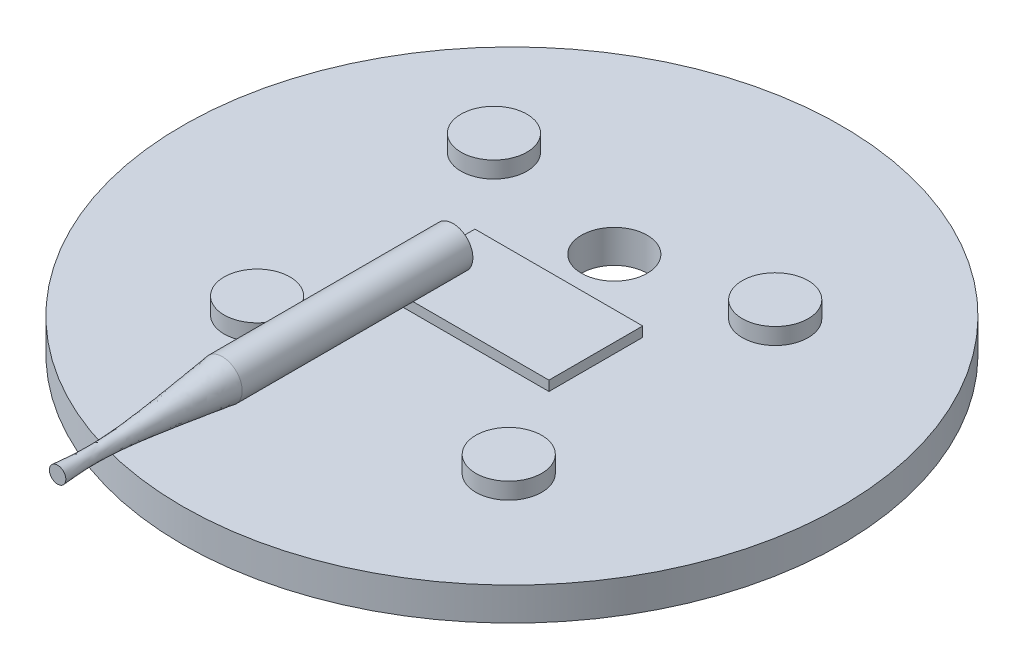
ISO-10303-21;
HEADER;
FILE_DESCRIPTION(('STEP AP214'),'2;1');
FILE_NAME('part.step','',(''),(''),'','','');
FILE_SCHEMA(('AUTOMOTIVE_DESIGN { 1 0 10303 214 1 1 1 1 }'));
ENDSEC;
DATA;
#1=APPLICATION_CONTEXT('core data for automotive mechanical design processes');
#2=APPLICATION_PROTOCOL_DEFINITION('international standard','automotive_design',2000,#1);
#3=PRODUCT_CONTEXT('',#1,'mechanical');
#4=PRODUCT('Part','Part','',(#3));
#5=PRODUCT_RELATED_PRODUCT_CATEGORY('part','',(#4));
#6=PRODUCT_DEFINITION_FORMATION('','',#4);
#7=PRODUCT_DEFINITION_CONTEXT('part definition',#1,'design');
#8=PRODUCT_DEFINITION('design','',#6,#7);
#9=PRODUCT_DEFINITION_SHAPE('','',#8);
#10=(LENGTH_UNIT() NAMED_UNIT(*) SI_UNIT(.MILLI.,.METRE.));
#11=(NAMED_UNIT(*) PLANE_ANGLE_UNIT() SI_UNIT($,.RADIAN.));
#12=(NAMED_UNIT(*) SI_UNIT($,.STERADIAN.) SOLID_ANGLE_UNIT());
#13=UNCERTAINTY_MEASURE_WITH_UNIT(LENGTH_MEASURE(1.E-05),#10,'distance_accuracy_value','');
#14=(GEOMETRIC_REPRESENTATION_CONTEXT(3) GLOBAL_UNCERTAINTY_ASSIGNED_CONTEXT((#13)) GLOBAL_UNIT_ASSIGNED_CONTEXT((#10,
#11,#12)) REPRESENTATION_CONTEXT('',''));
#15=CARTESIAN_POINT('',(0.,0.,0.));
#16=DIRECTION('',(0.,0.,1.));
#17=DIRECTION('',(1.,0.,0.));
#18=AXIS2_PLACEMENT_3D('',#15,#16,#17);
#19=CARTESIAN_POINT('',(-17.8510947741717,9.38178560839525,70.));
#20=DIRECTION('',(0.,0.,-1.));
#21=DIRECTION('',(-1.,0.,0.));
#22=AXIS2_PLACEMENT_3D('',#19,#20,#21);
#23=CYLINDRICAL_SURFACE('',#22,6.);
#24=CARTESIAN_POINT('',(-17.8510947741717,9.38178560839525,70.));
#25=DIRECTION('',(0.,0.,-1.));
#26=DIRECTION('',(-1.,0.,0.));
#27=AXIS2_PLACEMENT_3D('',#24,#25,#26);
#28=CIRCLE('',#27,6.);
#29=CARTESIAN_POINT('',(-11.9734748792229,8.17613874031923,70.));
#30=VERTEX_POINT('',#29);
#31=EDGE_CURVE('E12',#30,#30,#28,.F.);
#32=ORIENTED_EDGE('',*,*,#31,.F.);
#33=EDGE_LOOP('',(#32));
#34=FACE_BOUND('',#33,.T.);
#35=CARTESIAN_POINT('',(-17.8510947741717,9.38178560839525,0.));
#36=DIRECTION('',(0.,0.,1.));
#37=DIRECTION('',(1.,0.,0.));
#38=AXIS2_PLACEMENT_3D('',#35,#36,#37);
#39=CIRCLE('',#38,6.);
#40=CARTESIAN_POINT('',(-11.8510947741717,9.38178560839525,0.));
#41=VERTEX_POINT('',#40);
#42=EDGE_CURVE('E52',#41,#41,#39,.T.);
#43=ORIENTED_EDGE('',*,*,#42,.T.);
#44=EDGE_LOOP('',(#43));
#45=FACE_BOUND('',#44,.T.);
#46=ADVANCED_FACE('F45',(#34,#45),#23,.T.);
#47=CARTESIAN_POINT('',(-17.8510947741717,9.38178560839525,0.));
#48=DIRECTION('',(0.,0.,1.));
#49=DIRECTION('',(1.,0.,0.));
#50=AXIS2_PLACEMENT_3D('',#47,#48,#49);
#51=PLANE('',#50);
#52=ORIENTED_EDGE('',*,*,#42,.F.);
#53=EDGE_LOOP('',(#52));
#54=FACE_BOUND('',#53,.T.);
#55=ADVANCED_FACE('F78',(#54),#51,.F.);
#56=CARTESIAN_POINT('',(-17.8510947741717,9.38178560839525,120.));
#57=DIRECTION('',(0.,0.,1.));
#58=DIRECTION('',(1.,0.,0.));
#59=AXIS2_PLACEMENT_3D('',#56,#57,#58);
#60=PLANE('',#59);
#61=CARTESIAN_POINT('',(-17.8510947741717,9.38178560839525,120.));
#62=DIRECTION('',(0.,0.,1.));
#63=DIRECTION('',(1.,0.,0.));
#64=AXIS2_PLACEMENT_3D('',#61,#62,#63);
#65=CIRCLE('',#64,2.5);
#66=CARTESIAN_POINT('',(-19.0361616216132,7.18050948598466,120.));
#67=VERTEX_POINT('',#66);
#68=EDGE_CURVE('E56',#67,#67,#65,.T.);
#69=ORIENTED_EDGE('',*,*,#68,.T.);
#70=EDGE_LOOP('',(#69));
#71=FACE_BOUND('',#70,.T.);
#72=ADVANCED_FACE('F68',(#71),#60,.T.);
#73=CARTESIAN_POINT('',(-11.9734748792229,8.17613874031923,70.));
#74=CARTESIAN_POINT('',(-19.0361616216132,7.18050948598466,120.));
#75=CARTESIAN_POINT('',(-9.56218114307081,19.9313785302169,70.));
#76=CARTESIAN_POINT('',(-14.6336093767921,4.81037579110161,120.));
#77=CARTESIAN_POINT('',(-21.3174209329685,22.342672266369,70.));
#78=CARTESIAN_POINT('',(-12.263475681909,9.21292803592279,120.));
#79=CARTESIAN_POINT('',(-23.7287146691206,10.5874324764713,70.));
#80=CARTESIAN_POINT('',(-16.6660279267302,11.5830617308058,120.));
#81=CARTESIAN_POINT('',(-26.1400084052726,-1.1678073134264,70.));
#82=CARTESIAN_POINT('',(-21.0685801715514,13.9531954256889,120.));
#83=CARTESIAN_POINT('',(-14.3847686153749,-3.57910104957846,70.));
#84=CARTESIAN_POINT('',(-23.4387138664344,9.55064318086772,120.));
#85=CARTESIAN_POINT('',(-11.9734748792229,8.17613874031923,70.));
#86=CARTESIAN_POINT('',(-19.0361616216132,7.18050948598466,120.));
#87=(BOUNDED_SURFACE() B_SPLINE_SURFACE(3,1,((#73,#74),(#75,#76),(#77,#78),(#79,#80),(#81,#82),
(#83,#84),(#85,#86)),.UNSPECIFIED.,.T.,.F.,.F.) B_SPLINE_SURFACE_WITH_KNOTS((4,3,4),(2,2),(0.,
0.5,1.),(0.,1.),.UNSPECIFIED.) GEOMETRIC_REPRESENTATION_ITEM() RATIONAL_B_SPLINE_SURFACE(((1.,
1.),(0.333333333333333,0.333333333333333),(0.333333333333333,0.333333333333333),(1.,1.),
(0.333333333333333,0.333333333333333),(0.333333333333333,0.333333333333333),(1.,1.))) REPRESENTATION_ITEM('') SURFACE());
#88=CARTESIAN_POINT('',(-11.9734748792229,8.17613874031923,70.));
#89=CARTESIAN_POINT('',(-12.0470445327894,8.16576760225324,70.5208333333333));
#90=CARTESIAN_POINT('',(-12.120614186356,8.15539646418725,71.0416666666667));
#91=CARTESIAN_POINT('',(-12.2677534934891,8.13465418805528,72.0833333333333));
#92=CARTESIAN_POINT('',(-12.3413231470557,8.1242830499893,72.6041666666667));
#93=CARTESIAN_POINT('',(-12.4884624541888,8.10354077385733,73.6458333333333));
#94=CARTESIAN_POINT('',(-12.5620321077554,8.09316963579135,74.1666666666667));
#95=CARTESIAN_POINT('',(-12.7091714148885,8.07242735965938,75.2083333333333));
#96=CARTESIAN_POINT('',(-12.7827410684551,8.06205622159339,75.7291666666667));
#97=CARTESIAN_POINT('',(-12.9298803755882,8.04131394546142,76.7708333333333));
#98=CARTESIAN_POINT('',(-13.0034500291548,8.03094280739544,77.2916666666667));
#99=CARTESIAN_POINT('',(-13.1505893362879,8.01020053126346,78.3333333333333));
#100=CARTESIAN_POINT('',(-13.2241589898545,7.99982939319748,78.8541666666667));
#101=CARTESIAN_POINT('',(-13.3712982969876,7.97908711706551,79.8958333333333));
#102=CARTESIAN_POINT('',(-13.4448679505542,7.96871597899953,80.4166666666667));
#103=CARTESIAN_POINT('',(-13.5920072576873,7.94797370286756,81.4583333333333));
#104=CARTESIAN_POINT('',(-13.6655769112539,7.93760256480157,81.9791666666667));
#105=CARTESIAN_POINT('',(-13.812716218387,7.9168602886696,83.0208333333333));
#106=CARTESIAN_POINT('',(-13.8862858719536,7.90648915060362,83.5416666666667));
#107=CARTESIAN_POINT('',(-14.0334251790867,7.88574687447165,84.5833333333333));
#108=CARTESIAN_POINT('',(-14.1069948326533,7.87537573640566,85.1041666666667));
#109=CARTESIAN_POINT('',(-14.2541341397864,7.85463346027369,86.1458333333333));
#110=CARTESIAN_POINT('',(-14.327703793353,7.8442623222077,86.6666666666667));
#111=CARTESIAN_POINT('',(-14.4748431004861,7.82352004607574,87.7083333333333));
#112=CARTESIAN_POINT('',(-14.5484127540527,7.81314890800975,88.2291666666667));
#113=CARTESIAN_POINT('',(-14.6955520611858,7.79240663187778,89.2708333333333));
#114=CARTESIAN_POINT('',(-14.7691217147524,7.78203549381179,89.7916666666667));
#115=CARTESIAN_POINT('',(-14.9162610218855,7.76129321767982,90.8333333333333));
#116=CARTESIAN_POINT('',(-14.9898306754521,7.75092207961384,91.3541666666667));
#117=CARTESIAN_POINT('',(-15.1369699825852,7.73017980348187,92.3958333333333));
#118=CARTESIAN_POINT('',(-15.2105396361518,7.71980866541588,92.9166666666667));
#119=CARTESIAN_POINT('',(-15.3576789432849,7.69906638928391,93.9583333333333));
#120=CARTESIAN_POINT('',(-15.4312485968515,7.68869525121793,94.4791666666667));
#121=CARTESIAN_POINT('',(-15.5783879039846,7.66795297508596,95.5208333333333));
#122=CARTESIAN_POINT('',(-15.6519575575512,7.65758183701998,96.0416666666667));
#123=CARTESIAN_POINT('',(-15.7990968646843,7.636839560888,97.0833333333333));
#124=CARTESIAN_POINT('',(-15.8726665182509,7.62646842282202,97.6041666666667));
#125=CARTESIAN_POINT('',(-16.019805825384,7.60572614669005,98.6458333333333));
#126=CARTESIAN_POINT('',(-16.0933754789506,7.59535500862407,99.1666666666667));
#127=CARTESIAN_POINT('',(-16.2405147860837,7.5746127324921,100.208333333333));
#128=CARTESIAN_POINT('',(-16.3140844396503,7.56424159442611,100.729166666667));
#129=CARTESIAN_POINT('',(-16.4612237467834,7.54349931829414,101.770833333333));
#130=CARTESIAN_POINT('',(-16.53479340035,7.53312818022815,102.291666666667));
#131=CARTESIAN_POINT('',(-16.6819327074831,7.51238590409618,103.333333333333));
#132=CARTESIAN_POINT('',(-16.7555023610497,7.5020147660302,103.854166666667));
#133=CARTESIAN_POINT('',(-16.9026416681828,7.48127248989823,104.895833333333));
#134=CARTESIAN_POINT('',(-16.9762113217494,7.47090135183224,105.416666666667));
#135=CARTESIAN_POINT('',(-17.1233506288825,7.45015907570027,106.458333333333));
#136=CARTESIAN_POINT('',(-17.1969202824491,7.43978793763429,106.979166666667));
#137=CARTESIAN_POINT('',(-17.3440595895822,7.41904566150232,108.020833333333));
#138=CARTESIAN_POINT('',(-17.4176292431488,7.40867452343634,108.541666666667));
#139=CARTESIAN_POINT('',(-17.5647685502819,7.38793224730437,109.583333333333));
#140=CARTESIAN_POINT('',(-17.6383382038485,7.37756110923838,110.104166666667));
#141=CARTESIAN_POINT('',(-17.7854775109816,7.35681883310641,111.145833333333));
#142=CARTESIAN_POINT('',(-17.8590471645482,7.34644769504042,111.666666666667));
#143=CARTESIAN_POINT('',(-18.0061864716813,7.32570541890845,112.708333333333));
#144=CARTESIAN_POINT('',(-18.0797561252479,7.31533428084247,113.229166666667));
#145=CARTESIAN_POINT('',(-18.226895432381,7.2945920047105,114.270833333333));
#146=CARTESIAN_POINT('',(-18.3004650859476,7.28422086664451,114.791666666667));
#147=CARTESIAN_POINT('',(-18.4476043930807,7.26347859051254,115.833333333333));
#148=CARTESIAN_POINT('',(-18.5211740466473,7.25310745244656,116.354166666667));
#149=CARTESIAN_POINT('',(-18.6683133537804,7.23236517631459,117.395833333333));
#150=CARTESIAN_POINT('',(-18.741883007347,7.2219940382486,117.916666666667));
#151=CARTESIAN_POINT('',(-18.8890223144801,7.20125176211663,118.958333333333));
#152=CARTESIAN_POINT('',(-18.9625919680467,7.19088062405065,119.479166666667));
#153=CARTESIAN_POINT('',(-19.0361616216132,7.18050948598466,120.));
#154=B_SPLINE_CURVE_WITH_KNOTS('',3,(#88,#89,#90,#91,#92,#93,#94,#95,#96,#97,#98,#99,#100,#101,
#102,#103,#104,#105,#106,#107,#108,#109,#110,#111,#112,#113,#114,#115,#116,#117,#118,#119,#120,
#121,#122,#123,#124,#125,#126,#127,#128,#129,#130,#131,#132,#133,#134,#135,#136,#137,#138,#139,
#140,#141,#142,#143,#144,#145,#146,#147,#148,#149,#150,#151,#152,#153),.UNSPECIFIED.,.F.,.F.,(4,
2,2,2,2,2,2,2,2,2,2,2,2,2,2,2,2,2,2,2,2,2,2,2,2,2,2,2,2,2,2,2,4),(0.,1.57831769294912,
3.15663538589821,4.73495307884732,6.31327077179644,7.89158846474554,9.46990615769464,
11.0482238506438,12.6265415435929,14.204859236542,15.7831769294911,17.3614946224402,
18.9398123153893,20.5181300083384,22.0964477012875,23.6747653942366,25.2530830871857,
26.8314007801348,28.4097184730839,29.9880361660331,31.5663538589822,33.1446715519313,
34.7229892448804,36.3013069378295,37.8796246307786,39.4579423237277,41.0362600166768,
42.6145777096259,44.192895402575,45.7712130955241,47.3495307884732,48.9278484814224,
50.5061661743715),.UNSPECIFIED.);
#155=EDGE_CURVE('BSEAM77',#30,#67,#154,.T.);
#156=ORIENTED_EDGE('',*,*,#31,.T.);
#157=ORIENTED_EDGE('',*,*,#68,.F.);
#158=ORIENTED_EDGE('',*,*,#155,.T.);
#159=ORIENTED_EDGE('',*,*,#155,.F.);
#160=EDGE_LOOP('',(#156,#158,#157,#159));
#161=FACE_BOUND('',#160,.T.);
#162=ADVANCED_FACE('F77',(#161),#87,.T.);
#163=CLOSED_SHELL('',(#46,#55,#72,#162));
#164=MANIFOLD_SOLID_BREP('B2',#163);
#165=CARTESIAN_POINT('',(0.,-10.,0.));
#166=DIRECTION('',(0.,1.,0.));
#167=DIRECTION('',(0.,0.,1.));
#168=AXIS2_PLACEMENT_3D('',#165,#166,#167);
#169=CYLINDRICAL_SURFACE('',#168,100.);
#170=CARTESIAN_POINT('',(0.,-10.,0.));
#171=DIRECTION('',(0.,1.,0.));
#172=DIRECTION('',(0.,0.,1.));
#173=AXIS2_PLACEMENT_3D('',#170,#171,#172);
#174=CIRCLE('',#173,100.);
#175=CARTESIAN_POINT('',(0.,-10.,100.));
#176=VERTEX_POINT('',#175);
#177=EDGE_CURVE('E43',#176,#176,#174,.T.);
#178=ORIENTED_EDGE('',*,*,#177,.T.);
#179=EDGE_LOOP('',(#178));
#180=FACE_BOUND('',#179,.T.);
#181=CARTESIAN_POINT('',(0.,0.,0.));
#182=DIRECTION('',(0.,1.,0.));
#183=DIRECTION('',(0.,0.,1.));
#184=AXIS2_PLACEMENT_3D('',#181,#182,#183);
#185=CIRCLE('',#184,100.);
#186=CARTESIAN_POINT('',(0.,0.,100.));
#187=VERTEX_POINT('',#186);
#188=EDGE_CURVE('E135',#187,#187,#185,.T.);
#189=ORIENTED_EDGE('',*,*,#188,.F.);
#190=EDGE_LOOP('',(#189));
#191=FACE_BOUND('',#190,.T.);
#192=ADVANCED_FACE('F132',(#180,#191),#169,.T.);
#193=CARTESIAN_POINT('',(0.,-10.,0.));
#194=DIRECTION('',(0.,1.,0.));
#195=DIRECTION('',(0.,0.,1.));
#196=AXIS2_PLACEMENT_3D('',#193,#194,#195);
#197=PLANE('',#196);
#198=CARTESIAN_POINT('',(-0.694974250567611,-10.,-31.7644480540408));
#199=DIRECTION('',(0.,1.,0.));
#200=DIRECTION('',(0.,0.,1.));
#201=AXIS2_PLACEMENT_3D('',#198,#199,#200);
#202=CIRCLE('',#201,10.);
#203=CARTESIAN_POINT('',(-0.694974250567611,-10.,-21.7644480540408));
#204=VERTEX_POINT('',#203);
#205=EDGE_CURVE('E207',#204,#204,#202,.T.);
#206=ORIENTED_EDGE('',*,*,#205,.T.);
#207=EDGE_LOOP('',(#206));
#208=FACE_BOUND('',#207,.T.);
#209=ORIENTED_EDGE('',*,*,#177,.F.);
#210=EDGE_LOOP('',(#209));
#211=FACE_BOUND('',#210,.T.);
#212=ADVANCED_FACE('F252',(#208,#211),#197,.F.);
#213=CARTESIAN_POINT('',(0.,0.,0.));
#214=DIRECTION('',(0.,1.,0.));
#215=DIRECTION('',(0.,0.,1.));
#216=AXIS2_PLACEMENT_3D('',#213,#214,#215);
#217=PLANE('',#216);
#218=CARTESIAN_POINT('',(40.6413813486044,0.,-39.251018302468));
#219=DIRECTION('',(0.,1.,0.));
#220=DIRECTION('',(0.,0.,1.));
#221=AXIS2_PLACEMENT_3D('',#218,#219,#220);
#222=CIRCLE('',#221,10.);
#223=CARTESIAN_POINT('',(40.6413813486044,0.,-29.2510183024679));
#224=VERTEX_POINT('',#223);
#225=EDGE_CURVE('E234',#224,#224,#222,.T.);
#226=ORIENTED_EDGE('',*,*,#225,.F.);
#227=EDGE_LOOP('',(#226));
#228=FACE_BOUND('',#227,.T.);
#229=CARTESIAN_POINT('',(-45.7750295189545,0.,-40.3205283379575));
#230=DIRECTION('',(0.,1.,0.));
#231=DIRECTION('',(0.,0.,1.));
#232=AXIS2_PLACEMENT_3D('',#229,#230,#231);
#233=CIRCLE('',#232,10.);
#234=CARTESIAN_POINT('',(-45.7750295189545,0.,-30.3205283379575));
#235=VERTEX_POINT('',#234);
#236=EDGE_CURVE('E228',#235,#235,#233,.T.);
#237=ORIENTED_EDGE('',*,*,#236,.F.);
#238=EDGE_LOOP('',(#237));
#239=FACE_BOUND('',#238,.T.);
#240=CARTESIAN_POINT('',(-38.9301652918211,0.,38.3954102740763));
#241=DIRECTION('',(0.,1.,0.));
#242=DIRECTION('',(0.,0.,1.));
#243=AXIS2_PLACEMENT_3D('',#240,#241,#242);
#244=CIRCLE('',#243,10.);
#245=CARTESIAN_POINT('',(-38.9301652918211,0.,48.3954102740763));
#246=VERTEX_POINT('',#245);
#247=EDGE_CURVE('E222',#246,#246,#244,.T.);
#248=ORIENTED_EDGE('',*,*,#247,.F.);
#249=EDGE_LOOP('',(#248));
#250=FACE_BOUND('',#249,.T.);
#251=CARTESIAN_POINT('',(40.8552833557023,0.,41.817842387643));
#252=DIRECTION('',(0.,1.,0.));
#253=DIRECTION('',(0.,0.,1.));
#254=AXIS2_PLACEMENT_3D('',#251,#252,#253);
#255=CIRCLE('',#254,10.);
#256=CARTESIAN_POINT('',(40.8552833557023,0.,51.817842387643));
#257=VERTEX_POINT('',#256);
#258=EDGE_CURVE('E216',#257,#257,#255,.T.);
#259=ORIENTED_EDGE('',*,*,#258,.F.);
#260=EDGE_LOOP('',(#259));
#261=FACE_BOUND('',#260,.T.);
#262=CARTESIAN_POINT('',(-0.694974250567611,0.,-31.7644480540408));
#263=DIRECTION('',(0.,1.,0.));
#264=DIRECTION('',(0.,0.,1.));
#265=AXIS2_PLACEMENT_3D('',#262,#263,#264);
#266=CIRCLE('',#265,10.);
#267=CARTESIAN_POINT('',(-0.694974250567611,0.,-21.7644480540408));
#268=VERTEX_POINT('',#267);
#269=EDGE_CURVE('E212',#268,#268,#266,.T.);
#270=ORIENTED_EDGE('',*,*,#269,.F.);
#271=EDGE_LOOP('',(#270));
#272=FACE_BOUND('',#271,.T.);
#273=DIRECTION('',(0.,0.,-1.));
#274=VECTOR('',#273,1.);
#275=CARTESIAN_POINT('',(25.4543388446523,0.,-14.2244834720115));
#276=LINE('',#275,#274);
#277=CARTESIAN_POINT('',(25.4543388446523,0.,14.2244834720115));
#278=VERTEX_POINT('',#277);
#279=CARTESIAN_POINT('',(25.4543388446523,0.,-14.2244834720115));
#280=VERTEX_POINT('',#279);
#281=EDGE_CURVE('E146',#278,#280,#276,.T.);
#282=ORIENTED_EDGE('',*,*,#281,.F.);
#283=DIRECTION('',(1.,0.,0.));
#284=VECTOR('',#283,1.);
#285=CARTESIAN_POINT('',(-25.4543388446523,0.,14.2244834720115));
#286=LINE('',#285,#284);
#287=CARTESIAN_POINT('',(-25.4543388446523,0.,14.2244834720115));
#288=VERTEX_POINT('',#287);
#289=EDGE_CURVE('E150',#288,#278,#286,.T.);
#290=ORIENTED_EDGE('',*,*,#289,.F.);
#291=DIRECTION('',(0.,0.,1.));
#292=VECTOR('',#291,1.);
#293=CARTESIAN_POINT('',(-25.4543388446523,0.,-14.2244834720115));
#294=LINE('',#293,#292);
#295=CARTESIAN_POINT('',(-25.4543388446523,0.,-14.2244834720115));
#296=VERTEX_POINT('',#295);
#297=EDGE_CURVE('E202',#296,#288,#294,.T.);
#298=ORIENTED_EDGE('',*,*,#297,.F.);
#299=DIRECTION('',(-1.,0.,0.));
#300=VECTOR('',#299,1.);
#301=CARTESIAN_POINT('',(-25.4543388446523,0.,-14.2244834720115));
#302=LINE('',#301,#300);
#303=EDGE_CURVE('E204',#280,#296,#302,.T.);
#304=ORIENTED_EDGE('',*,*,#303,.F.);
#305=EDGE_LOOP('',(#282,#290,#298,#304));
#306=FACE_BOUND('',#305,.T.);
#307=ORIENTED_EDGE('',*,*,#188,.T.);
#308=EDGE_LOOP('',(#307));
#309=FACE_BOUND('',#308,.T.);
#310=ADVANCED_FACE('F249',(#228,#239,#250,#261,#272,#306,#309),#217,.T.);
#311=CARTESIAN_POINT('',(25.4543388446523,3.,-14.2244834720115));
#312=DIRECTION('',(-1.,0.,0.));
#313=DIRECTION('',(0.,0.,1.));
#314=AXIS2_PLACEMENT_3D('',#311,#312,#313);
#315=PLANE('',#314);
#316=ORIENTED_EDGE('',*,*,#281,.T.);
#317=DIRECTION('',(0.,-1.,0.));
#318=VECTOR('',#317,1.);
#319=CARTESIAN_POINT('',(25.4543388446523,3.,-14.2244834720115));
#320=LINE('',#319,#318);
#321=CARTESIAN_POINT('',(25.4543388446523,3.,-14.2244834720115));
#322=VERTEX_POINT('',#321);
#323=EDGE_CURVE('E175',#322,#280,#320,.T.);
#324=ORIENTED_EDGE('',*,*,#323,.F.);
#325=DIRECTION('',(0.,0.,-1.));
#326=VECTOR('',#325,1.);
#327=CARTESIAN_POINT('',(25.4543388446523,3.,-14.2244834720115));
#328=LINE('',#327,#326);
#329=CARTESIAN_POINT('',(25.4543388446523,3.,14.2244834720115));
#330=VERTEX_POINT('',#329);
#331=EDGE_CURVE('E181',#330,#322,#328,.T.);
#332=ORIENTED_EDGE('',*,*,#331,.F.);
#333=DIRECTION('',(0.,-1.,0.));
#334=VECTOR('',#333,1.);
#335=CARTESIAN_POINT('',(25.4543388446523,3.,14.2244834720115));
#336=LINE('',#335,#334);
#337=EDGE_CURVE('E199',#330,#278,#336,.T.);
#338=ORIENTED_EDGE('',*,*,#337,.T.);
#339=EDGE_LOOP('',(#316,#324,#332,#338));
#340=FACE_BOUND('',#339,.T.);
#341=ADVANCED_FACE('F191',(#340),#315,.F.);
#342=CARTESIAN_POINT('',(-25.4543388446523,3.,-14.2244834720115));
#343=DIRECTION('',(0.,0.,1.));
#344=DIRECTION('',(1.,0.,0.));
#345=AXIS2_PLACEMENT_3D('',#342,#343,#344);
#346=PLANE('',#345);
#347=ORIENTED_EDGE('',*,*,#303,.T.);
#348=DIRECTION('',(0.,-1.,0.));
#349=VECTOR('',#348,1.);
#350=CARTESIAN_POINT('',(-25.4543388446523,3.,-14.2244834720115));
#351=LINE('',#350,#349);
#352=CARTESIAN_POINT('',(-25.4543388446523,3.,-14.2244834720115));
#353=VERTEX_POINT('',#352);
#354=EDGE_CURVE('E177',#353,#296,#351,.T.);
#355=ORIENTED_EDGE('',*,*,#354,.F.);
#356=DIRECTION('',(-1.,0.,0.));
#357=VECTOR('',#356,1.);
#358=CARTESIAN_POINT('',(-25.4543388446523,3.,-14.2244834720115));
#359=LINE('',#358,#357);
#360=EDGE_CURVE('E170',#322,#353,#359,.T.);
#361=ORIENTED_EDGE('',*,*,#360,.F.);
#362=ORIENTED_EDGE('',*,*,#323,.T.);
#363=EDGE_LOOP('',(#347,#355,#361,#362));
#364=FACE_BOUND('',#363,.T.);
#365=ADVANCED_FACE('F173',(#364),#346,.F.);
#366=CARTESIAN_POINT('',(-25.4543388446523,3.,-14.2244834720115));
#367=DIRECTION('',(1.,0.,0.));
#368=DIRECTION('',(0.,0.,-1.));
#369=AXIS2_PLACEMENT_3D('',#366,#367,#368);
#370=PLANE('',#369);
#371=ORIENTED_EDGE('',*,*,#297,.T.);
#372=DIRECTION('',(0.,-1.,0.));
#373=VECTOR('',#372,1.);
#374=CARTESIAN_POINT('',(-25.4543388446523,3.,14.2244834720115));
#375=LINE('',#374,#373);
#376=CARTESIAN_POINT('',(-25.4543388446523,3.,14.2244834720115));
#377=VERTEX_POINT('',#376);
#378=EDGE_CURVE('E194',#377,#288,#375,.T.);
#379=ORIENTED_EDGE('',*,*,#378,.F.);
#380=DIRECTION('',(0.,0.,1.));
#381=VECTOR('',#380,1.);
#382=CARTESIAN_POINT('',(-25.4543388446523,3.,-14.2244834720115));
#383=LINE('',#382,#381);
#384=EDGE_CURVE('E180',#353,#377,#383,.T.);
#385=ORIENTED_EDGE('',*,*,#384,.F.);
#386=ORIENTED_EDGE('',*,*,#354,.T.);
#387=EDGE_LOOP('',(#371,#379,#385,#386));
#388=FACE_BOUND('',#387,.T.);
#389=ADVANCED_FACE('F279',(#388),#370,.F.);
#390=CARTESIAN_POINT('',(-25.4543388446523,3.,14.2244834720115));
#391=DIRECTION('',(0.,0.,-1.));
#392=DIRECTION('',(-1.,0.,0.));
#393=AXIS2_PLACEMENT_3D('',#390,#391,#392);
#394=PLANE('',#393);
#395=ORIENTED_EDGE('',*,*,#289,.T.);
#396=ORIENTED_EDGE('',*,*,#337,.F.);
#397=DIRECTION('',(1.,0.,0.));
#398=VECTOR('',#397,1.);
#399=CARTESIAN_POINT('',(-25.4543388446523,3.,14.2244834720115));
#400=LINE('',#399,#398);
#401=EDGE_CURVE('E186',#377,#330,#400,.T.);
#402=ORIENTED_EDGE('',*,*,#401,.F.);
#403=ORIENTED_EDGE('',*,*,#378,.T.);
#404=EDGE_LOOP('',(#395,#396,#402,#403));
#405=FACE_BOUND('',#404,.T.);
#406=ADVANCED_FACE('F282',(#405),#394,.F.);
#407=CARTESIAN_POINT('',(0.,3.,0.));
#408=DIRECTION('',(0.,1.,0.));
#409=DIRECTION('',(0.,0.,1.));
#410=AXIS2_PLACEMENT_3D('',#407,#408,#409);
#411=PLANE('',#410);
#412=ORIENTED_EDGE('',*,*,#331,.T.);
#413=ORIENTED_EDGE('',*,*,#360,.T.);
#414=ORIENTED_EDGE('',*,*,#384,.T.);
#415=ORIENTED_EDGE('',*,*,#401,.T.);
#416=EDGE_LOOP('',(#412,#413,#414,#415));
#417=FACE_BOUND('',#416,.T.);
#418=ADVANCED_FACE('F184',(#417),#411,.T.);
#419=CARTESIAN_POINT('',(-0.694974250567611,-13.,-31.7644480540408));
#420=DIRECTION('',(0.,1.,0.));
#421=DIRECTION('',(0.,0.,1.));
#422=AXIS2_PLACEMENT_3D('',#419,#420,#421);
#423=CYLINDRICAL_SURFACE('',#422,10.);
#424=ORIENTED_EDGE('',*,*,#269,.T.);
#425=EDGE_LOOP('',(#424));
#426=FACE_BOUND('',#425,.T.);
#427=ORIENTED_EDGE('',*,*,#205,.F.);
#428=EDGE_LOOP('',(#427));
#429=FACE_BOUND('',#428,.T.);
#430=ADVANCED_FACE('F289',(#426,#429),#423,.F.);
#431=CARTESIAN_POINT('',(40.8552833557023,5.,41.817842387643));
#432=DIRECTION('',(0.,-1.,0.));
#433=DIRECTION('',(0.,0.,-1.));
#434=AXIS2_PLACEMENT_3D('',#431,#432,#433);
#435=CYLINDRICAL_SURFACE('',#434,10.);
#436=CARTESIAN_POINT('',(40.8552833557023,5.,41.817842387643));
#437=DIRECTION('',(0.,1.,0.));
#438=DIRECTION('',(0.,0.,1.));
#439=AXIS2_PLACEMENT_3D('',#436,#437,#438);
#440=CIRCLE('',#439,10.);
#441=CARTESIAN_POINT('',(40.8552833557023,5.,51.817842387643));
#442=VERTEX_POINT('',#441);
#443=EDGE_CURVE('E215',#442,#442,#440,.T.);
#444=ORIENTED_EDGE('',*,*,#443,.F.);
#445=EDGE_LOOP('',(#444));
#446=FACE_BOUND('',#445,.T.);
#447=ORIENTED_EDGE('',*,*,#258,.T.);
#448=EDGE_LOOP('',(#447));
#449=FACE_BOUND('',#448,.T.);
#450=ADVANCED_FACE('F292',(#446,#449),#435,.T.);
#451=CARTESIAN_POINT('',(40.8552833557023,5.,41.817842387643));
#452=DIRECTION('',(0.,1.,0.));
#453=DIRECTION('',(0.,0.,1.));
#454=AXIS2_PLACEMENT_3D('',#451,#452,#453);
#455=PLANE('',#454);
#456=ORIENTED_EDGE('',*,*,#443,.T.);
#457=EDGE_LOOP('',(#456));
#458=FACE_BOUND('',#457,.T.);
#459=ADVANCED_FACE('F296',(#458),#455,.T.);
#460=CARTESIAN_POINT('',(-38.9301652918211,5.,38.3954102740763));
#461=DIRECTION('',(0.,-1.,0.));
#462=DIRECTION('',(0.,0.,-1.));
#463=AXIS2_PLACEMENT_3D('',#460,#461,#462);
#464=CYLINDRICAL_SURFACE('',#463,10.);
#465=CARTESIAN_POINT('',(-38.9301652918211,5.,38.3954102740763));
#466=DIRECTION('',(0.,1.,0.));
#467=DIRECTION('',(0.,0.,1.));
#468=AXIS2_PLACEMENT_3D('',#465,#466,#467);
#469=CIRCLE('',#468,10.);
#470=CARTESIAN_POINT('',(-38.9301652918211,5.,48.3954102740763));
#471=VERTEX_POINT('',#470);
#472=EDGE_CURVE('E219',#471,#471,#469,.T.);
#473=ORIENTED_EDGE('',*,*,#472,.F.);
#474=EDGE_LOOP('',(#473));
#475=FACE_BOUND('',#474,.T.);
#476=ORIENTED_EDGE('',*,*,#247,.T.);
#477=EDGE_LOOP('',(#476));
#478=FACE_BOUND('',#477,.T.);
#479=ADVANCED_FACE('F300',(#475,#478),#464,.T.);
#480=CARTESIAN_POINT('',(-38.9301652918211,5.,38.3954102740763));
#481=DIRECTION('',(0.,1.,0.));
#482=DIRECTION('',(0.,0.,1.));
#483=AXIS2_PLACEMENT_3D('',#480,#481,#482);
#484=PLANE('',#483);
#485=ORIENTED_EDGE('',*,*,#472,.T.);
#486=EDGE_LOOP('',(#485));
#487=FACE_BOUND('',#486,.T.);
#488=ADVANCED_FACE('F304',(#487),#484,.T.);
#489=CARTESIAN_POINT('',(-45.7750295189545,5.,-40.3205283379575));
#490=DIRECTION('',(0.,-1.,0.));
#491=DIRECTION('',(0.,0.,-1.));
#492=AXIS2_PLACEMENT_3D('',#489,#490,#491);
#493=CYLINDRICAL_SURFACE('',#492,10.);
#494=CARTESIAN_POINT('',(-45.7750295189545,5.,-40.3205283379575));
#495=DIRECTION('',(0.,1.,0.));
#496=DIRECTION('',(0.,0.,1.));
#497=AXIS2_PLACEMENT_3D('',#494,#495,#496);
#498=CIRCLE('',#497,10.);
#499=CARTESIAN_POINT('',(-45.7750295189545,5.,-30.3205283379575));
#500=VERTEX_POINT('',#499);
#501=EDGE_CURVE('E225',#500,#500,#498,.T.);
#502=ORIENTED_EDGE('',*,*,#501,.F.);
#503=EDGE_LOOP('',(#502));
#504=FACE_BOUND('',#503,.T.);
#505=ORIENTED_EDGE('',*,*,#236,.T.);
#506=EDGE_LOOP('',(#505));
#507=FACE_BOUND('',#506,.T.);
#508=ADVANCED_FACE('F308',(#504,#507),#493,.T.);
#509=CARTESIAN_POINT('',(-45.7750295189545,5.,-40.3205283379575));
#510=DIRECTION('',(0.,1.,0.));
#511=DIRECTION('',(0.,0.,1.));
#512=AXIS2_PLACEMENT_3D('',#509,#510,#511);
#513=PLANE('',#512);
#514=ORIENTED_EDGE('',*,*,#501,.T.);
#515=EDGE_LOOP('',(#514));
#516=FACE_BOUND('',#515,.T.);
#517=ADVANCED_FACE('F245',(#516),#513,.T.);
#518=CARTESIAN_POINT('',(40.6413813486044,5.,-39.251018302468));
#519=DIRECTION('',(0.,-1.,0.));
#520=DIRECTION('',(0.,0.,-1.));
#521=AXIS2_PLACEMENT_3D('',#518,#519,#520);
#522=CYLINDRICAL_SURFACE('',#521,10.);
#523=CARTESIAN_POINT('',(40.6413813486044,5.,-39.251018302468));
#524=DIRECTION('',(0.,1.,0.));
#525=DIRECTION('',(0.,0.,1.));
#526=AXIS2_PLACEMENT_3D('',#523,#524,#525);
#527=CIRCLE('',#526,10.);
#528=CARTESIAN_POINT('',(40.6413813486044,5.,-29.2510183024679));
#529=VERTEX_POINT('',#528);
#530=EDGE_CURVE('E231',#529,#529,#527,.T.);
#531=ORIENTED_EDGE('',*,*,#530,.F.);
#532=EDGE_LOOP('',(#531));
#533=FACE_BOUND('',#532,.T.);
#534=ORIENTED_EDGE('',*,*,#225,.T.);
#535=EDGE_LOOP('',(#534));
#536=FACE_BOUND('',#535,.T.);
#537=ADVANCED_FACE('F242',(#533,#536),#522,.T.);
#538=CARTESIAN_POINT('',(40.6413813486044,5.,-39.251018302468));
#539=DIRECTION('',(0.,1.,0.));
#540=DIRECTION('',(0.,0.,1.));
#541=AXIS2_PLACEMENT_3D('',#538,#539,#540);
#542=PLANE('',#541);
#543=ORIENTED_EDGE('',*,*,#530,.T.);
#544=EDGE_LOOP('',(#543));
#545=FACE_BOUND('',#544,.T.);
#546=ADVANCED_FACE('F240',(#545),#542,.T.);
#547=CLOSED_SHELL('',(#192,#212,#310,#341,#365,#389,#406,#418,#430,#450,#459,#479,#488,#508,
#517,#537,#546));
#548=MANIFOLD_SOLID_BREP('B7',#547);
#549=ADVANCED_BREP_SHAPE_REPRESENTATION('',(#18,#164,#548),#14);
#550=SHAPE_DEFINITION_REPRESENTATION(#9,#549);
ENDSEC;
END-ISO-10303-21;
